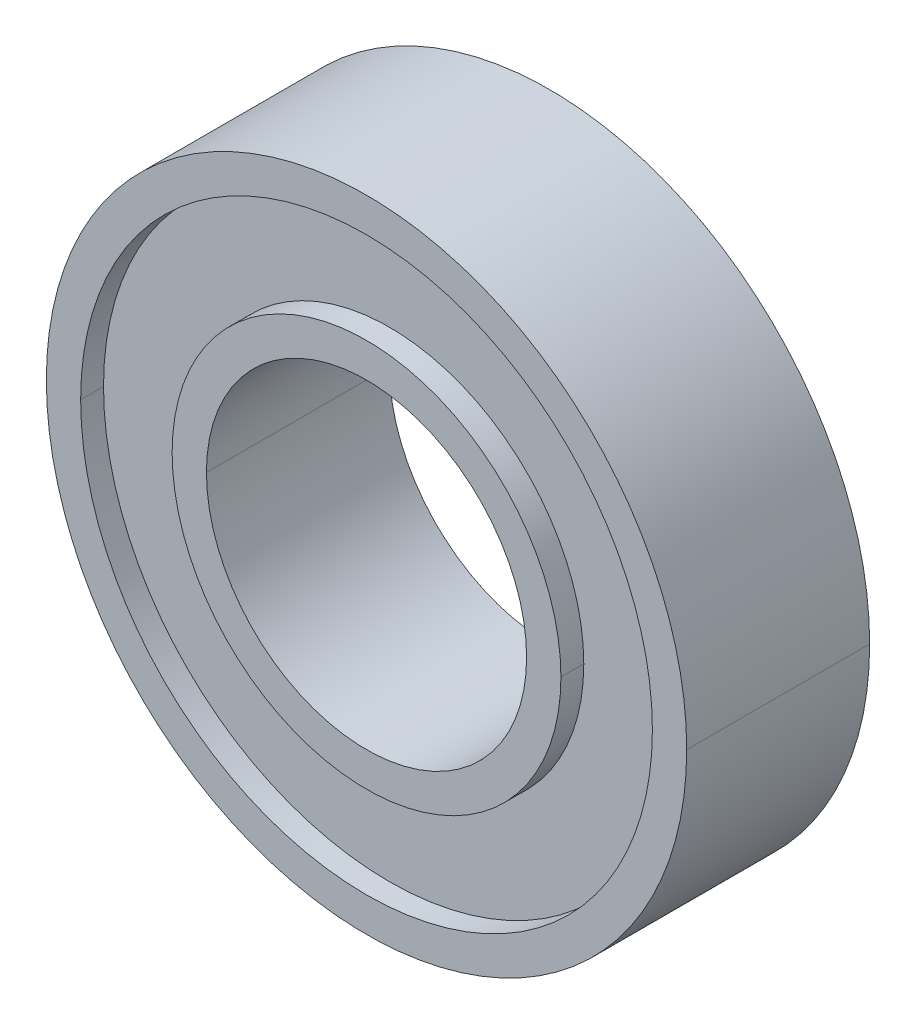
ISO-10303-21;
HEADER;
FILE_DESCRIPTION(('STEP AP214'),'2;1');
FILE_NAME('part.step','',(''),(''),'','','');
FILE_SCHEMA(('AUTOMOTIVE_DESIGN { 1 0 10303 214 1 1 1 1 }'));
ENDSEC;
DATA;
#1=APPLICATION_CONTEXT('core data for automotive mechanical design processes');
#2=APPLICATION_PROTOCOL_DEFINITION('international standard','automotive_design',2000,#1);
#3=PRODUCT_CONTEXT('',#1,'mechanical');
#4=PRODUCT('Part','Part','',(#3));
#5=PRODUCT_RELATED_PRODUCT_CATEGORY('part','',(#4));
#6=PRODUCT_DEFINITION_FORMATION('','',#4);
#7=PRODUCT_DEFINITION_CONTEXT('part definition',#1,'design');
#8=PRODUCT_DEFINITION('design','',#6,#7);
#9=PRODUCT_DEFINITION_SHAPE('','',#8);
#10=(LENGTH_UNIT() NAMED_UNIT(*) SI_UNIT(.MILLI.,.METRE.));
#11=(NAMED_UNIT(*) PLANE_ANGLE_UNIT() SI_UNIT($,.RADIAN.));
#12=(NAMED_UNIT(*) SI_UNIT($,.STERADIAN.) SOLID_ANGLE_UNIT());
#13=UNCERTAINTY_MEASURE_WITH_UNIT(LENGTH_MEASURE(1.E-05),#10,'distance_accuracy_value','');
#14=(GEOMETRIC_REPRESENTATION_CONTEXT(3) GLOBAL_UNCERTAINTY_ASSIGNED_CONTEXT((#13)) GLOBAL_UNIT_ASSIGNED_CONTEXT((#10,
#11,#12)) REPRESENTATION_CONTEXT('',''));
#15=CARTESIAN_POINT('',(0.,0.,0.));
#16=DIRECTION('',(0.,0.,1.));
#17=DIRECTION('',(1.,0.,0.));
#18=AXIS2_PLACEMENT_3D('',#15,#16,#17);
#19=CARTESIAN_POINT('',(0.,0.,0.));
#20=DIRECTION('',(0.,0.,1.));
#21=DIRECTION('',(1.,0.,0.));
#22=AXIS2_PLACEMENT_3D('',#19,#20,#21);
#23=PLANE('',#22);
#24=CARTESIAN_POINT('',(0.,0.,0.));
#25=DIRECTION('',(0.,0.,-1.));
#26=DIRECTION('',(-1.,0.,0.));
#27=AXIS2_PLACEMENT_3D('',#24,#25,#26);
#28=CIRCLE('',#27,3.5);
#29=CARTESIAN_POINT('',(-3.5,0.,0.));
#30=VERTEX_POINT('',#29);
#31=CARTESIAN_POINT('',(3.5,0.,0.));
#32=VERTEX_POINT('',#31);
#33=EDGE_CURVE('E27',#30,#32,#28,.T.);
#34=ORIENTED_EDGE('',*,*,#33,.F.);
#35=CARTESIAN_POINT('',(0.,0.,0.));
#36=DIRECTION('',(0.,0.,-1.));
#37=DIRECTION('',(1.,0.,0.));
#38=AXIS2_PLACEMENT_3D('',#35,#36,#37);
#39=CIRCLE('',#38,3.5);
#40=EDGE_CURVE('E36',#32,#30,#39,.T.);
#41=ORIENTED_EDGE('',*,*,#40,.F.);
#42=EDGE_LOOP('',(#34,#41));
#43=FACE_BOUND('',#42,.T.);
#44=CARTESIAN_POINT('',(0.,0.,0.));
#45=DIRECTION('',(0.,0.,1.));
#46=DIRECTION('',(1.,0.,0.));
#47=AXIS2_PLACEMENT_3D('',#44,#45,#46);
#48=CIRCLE('',#47,4.25);
#49=CARTESIAN_POINT('',(4.25,0.,0.));
#50=VERTEX_POINT('',#49);
#51=CARTESIAN_POINT('',(-4.25,0.,0.));
#52=VERTEX_POINT('',#51);
#53=EDGE_CURVE('E104',#50,#52,#48,.T.);
#54=ORIENTED_EDGE('',*,*,#53,.F.);
#55=CARTESIAN_POINT('',(0.,0.,0.));
#56=DIRECTION('',(0.,0.,1.));
#57=DIRECTION('',(-1.,0.,0.));
#58=AXIS2_PLACEMENT_3D('',#55,#56,#57);
#59=CIRCLE('',#58,4.25);
#60=EDGE_CURVE('E102',#52,#50,#59,.T.);
#61=ORIENTED_EDGE('',*,*,#60,.F.);
#62=EDGE_LOOP('',(#54,#61));
#63=FACE_BOUND('',#62,.T.);
#64=ADVANCED_FACE('F16',(#43,#63),#23,.F.);
#65=CARTESIAN_POINT('',(0.,0.,0.));
#66=DIRECTION('',(0.,0.,-1.));
#67=DIRECTION('',(1.,0.,0.));
#68=AXIS2_PLACEMENT_3D('',#65,#66,#67);
#69=CYLINDRICAL_SURFACE('',#68,3.5);
#70=DIRECTION('',(0.,0.,1.));
#71=VECTOR('',#70,1.);
#72=CARTESIAN_POINT('',(3.5,0.,0.));
#73=LINE('',#72,#71);
#74=CARTESIAN_POINT('',(3.5,0.,4.));
#75=VERTEX_POINT('',#74);
#76=EDGE_CURVE('E11',#32,#75,#73,.T.);
#77=ORIENTED_EDGE('',*,*,#76,.T.);
#78=CARTESIAN_POINT('',(0.,0.,4.));
#79=DIRECTION('',(0.,0.,-1.));
#80=DIRECTION('',(-1.,0.,0.));
#81=AXIS2_PLACEMENT_3D('',#78,#79,#80);
#82=CIRCLE('',#81,3.5);
#83=CARTESIAN_POINT('',(-3.5,0.,4.));
#84=VERTEX_POINT('',#83);
#85=EDGE_CURVE('E150',#84,#75,#82,.T.);
#86=ORIENTED_EDGE('',*,*,#85,.F.);
#87=DIRECTION('',(0.,0.,1.));
#88=VECTOR('',#87,1.);
#89=CARTESIAN_POINT('',(-3.5,0.,0.));
#90=LINE('',#89,#88);
#91=EDGE_CURVE('E164',#30,#84,#90,.T.);
#92=ORIENTED_EDGE('',*,*,#91,.F.);
#93=ORIENTED_EDGE('',*,*,#33,.T.);
#94=EDGE_LOOP('',(#77,#86,#92,#93));
#95=FACE_BOUND('',#94,.T.);
#96=ADVANCED_FACE('F201',(#95),#69,.F.);
#97=CARTESIAN_POINT('',(0.,0.,0.));
#98=DIRECTION('',(0.,0.,-1.));
#99=DIRECTION('',(1.,0.,0.));
#100=AXIS2_PLACEMENT_3D('',#97,#98,#99);
#101=CYLINDRICAL_SURFACE('',#100,3.5);
#102=ORIENTED_EDGE('',*,*,#91,.T.);
#103=CARTESIAN_POINT('',(0.,0.,4.));
#104=DIRECTION('',(0.,0.,-1.));
#105=DIRECTION('',(1.,0.,0.));
#106=AXIS2_PLACEMENT_3D('',#103,#104,#105);
#107=CIRCLE('',#106,3.5);
#108=EDGE_CURVE('E152',#75,#84,#107,.T.);
#109=ORIENTED_EDGE('',*,*,#108,.F.);
#110=ORIENTED_EDGE('',*,*,#76,.F.);
#111=ORIENTED_EDGE('',*,*,#40,.T.);
#112=EDGE_LOOP('',(#102,#109,#110,#111));
#113=FACE_BOUND('',#112,.T.);
#114=ADVANCED_FACE('F204',(#113),#101,.F.);
#115=CARTESIAN_POINT('',(0.,0.,0.));
#116=DIRECTION('',(0.,0.,-1.));
#117=DIRECTION('',(1.,0.,0.));
#118=AXIS2_PLACEMENT_3D('',#115,#116,#117);
#119=CYLINDRICAL_SURFACE('',#118,4.25);
#120=ORIENTED_EDGE('',*,*,#53,.T.);
#121=DIRECTION('',(0.,0.,1.));
#122=VECTOR('',#121,1.);
#123=CARTESIAN_POINT('',(-4.25,0.,0.));
#124=LINE('',#123,#122);
#125=CARTESIAN_POINT('',(-4.25,0.,0.5));
#126=VERTEX_POINT('',#125);
#127=EDGE_CURVE('E116',#52,#126,#124,.T.);
#128=ORIENTED_EDGE('',*,*,#127,.T.);
#129=CARTESIAN_POINT('',(0.,0.,0.5));
#130=DIRECTION('',(0.,0.,-1.));
#131=DIRECTION('',(-1.,0.,0.));
#132=AXIS2_PLACEMENT_3D('',#129,#130,#131);
#133=CIRCLE('',#132,4.25);
#134=CARTESIAN_POINT('',(4.25,0.,0.5));
#135=VERTEX_POINT('',#134);
#136=EDGE_CURVE('E122',#126,#135,#133,.T.);
#137=ORIENTED_EDGE('',*,*,#136,.T.);
#138=DIRECTION('',(0.,0.,1.));
#139=VECTOR('',#138,1.);
#140=CARTESIAN_POINT('',(4.25,0.,0.));
#141=LINE('',#140,#139);
#142=EDGE_CURVE('E110',#50,#135,#141,.T.);
#143=ORIENTED_EDGE('',*,*,#142,.F.);
#144=EDGE_LOOP('',(#120,#128,#137,#143));
#145=FACE_BOUND('',#144,.T.);
#146=ADVANCED_FACE('F114',(#145),#119,.T.);
#147=CARTESIAN_POINT('',(0.,0.,0.));
#148=DIRECTION('',(0.,0.,-1.));
#149=DIRECTION('',(1.,0.,0.));
#150=AXIS2_PLACEMENT_3D('',#147,#148,#149);
#151=CYLINDRICAL_SURFACE('',#150,4.25);
#152=CARTESIAN_POINT('',(0.,0.,0.5));
#153=DIRECTION('',(0.,0.,-1.));
#154=DIRECTION('',(1.,0.,0.));
#155=AXIS2_PLACEMENT_3D('',#152,#153,#154);
#156=CIRCLE('',#155,4.25);
#157=EDGE_CURVE('E109',#135,#126,#156,.T.);
#158=ORIENTED_EDGE('',*,*,#157,.T.);
#159=ORIENTED_EDGE('',*,*,#127,.F.);
#160=ORIENTED_EDGE('',*,*,#60,.T.);
#161=ORIENTED_EDGE('',*,*,#142,.T.);
#162=EDGE_LOOP('',(#158,#159,#160,#161));
#163=FACE_BOUND('',#162,.T.);
#164=ADVANCED_FACE('F18',(#163),#151,.T.);
#165=CARTESIAN_POINT('',(0.,0.,4.));
#166=DIRECTION('',(0.,0.,1.));
#167=DIRECTION('',(1.,0.,0.));
#168=AXIS2_PLACEMENT_3D('',#165,#166,#167);
#169=PLANE('',#168);
#170=ORIENTED_EDGE('',*,*,#85,.T.);
#171=ORIENTED_EDGE('',*,*,#108,.T.);
#172=EDGE_LOOP('',(#170,#171));
#173=FACE_BOUND('',#172,.T.);
#174=CARTESIAN_POINT('',(0.,0.,4.));
#175=DIRECTION('',(0.,0.,1.));
#176=DIRECTION('',(1.,0.,0.));
#177=AXIS2_PLACEMENT_3D('',#174,#175,#176);
#178=CIRCLE('',#177,4.25);
#179=CARTESIAN_POINT('',(4.25,0.,4.));
#180=VERTEX_POINT('',#179);
#181=CARTESIAN_POINT('',(-4.25,0.,4.));
#182=VERTEX_POINT('',#181);
#183=EDGE_CURVE('E168',#180,#182,#178,.T.);
#184=ORIENTED_EDGE('',*,*,#183,.T.);
#185=CARTESIAN_POINT('',(0.,0.,4.));
#186=DIRECTION('',(0.,0.,1.));
#187=DIRECTION('',(-1.,0.,0.));
#188=AXIS2_PLACEMENT_3D('',#185,#186,#187);
#189=CIRCLE('',#188,4.25);
#190=EDGE_CURVE('E191',#182,#180,#189,.T.);
#191=ORIENTED_EDGE('',*,*,#190,.T.);
#192=EDGE_LOOP('',(#184,#191));
#193=FACE_BOUND('',#192,.T.);
#194=ADVANCED_FACE('F206',(#173,#193),#169,.T.);
#195=CARTESIAN_POINT('',(0.,0.,0.5));
#196=DIRECTION('',(0.,0.,1.));
#197=DIRECTION('',(1.,0.,0.));
#198=AXIS2_PLACEMENT_3D('',#195,#196,#197);
#199=PLANE('',#198);
#200=CARTESIAN_POINT('',(0.,0.,0.5));
#201=DIRECTION('',(0.,0.,1.));
#202=DIRECTION('',(-1.,0.,0.));
#203=AXIS2_PLACEMENT_3D('',#200,#201,#202);
#204=CIRCLE('',#203,6.25);
#205=CARTESIAN_POINT('',(-6.25,0.,0.5));
#206=VERTEX_POINT('',#205);
#207=CARTESIAN_POINT('',(6.25,0.,0.5));
#208=VERTEX_POINT('',#207);
#209=EDGE_CURVE('E149',#206,#208,#204,.T.);
#210=ORIENTED_EDGE('',*,*,#209,.F.);
#211=CARTESIAN_POINT('',(0.,0.,0.5));
#212=DIRECTION('',(0.,0.,1.));
#213=DIRECTION('',(1.,0.,0.));
#214=AXIS2_PLACEMENT_3D('',#211,#212,#213);
#215=CIRCLE('',#214,6.25);
#216=EDGE_CURVE('E154',#208,#206,#215,.T.);
#217=ORIENTED_EDGE('',*,*,#216,.F.);
#218=EDGE_LOOP('',(#210,#217));
#219=FACE_BOUND('',#218,.T.);
#220=ORIENTED_EDGE('',*,*,#136,.F.);
#221=ORIENTED_EDGE('',*,*,#157,.F.);
#222=EDGE_LOOP('',(#220,#221));
#223=FACE_BOUND('',#222,.T.);
#224=ADVANCED_FACE('F209',(#219,#223),#199,.F.);
#225=CARTESIAN_POINT('',(0.,0.,4.));
#226=DIRECTION('',(0.,0.,-1.));
#227=DIRECTION('',(1.,0.,0.));
#228=AXIS2_PLACEMENT_3D('',#225,#226,#227);
#229=CYLINDRICAL_SURFACE('',#228,4.25);
#230=DIRECTION('',(0.,0.,-1.));
#231=VECTOR('',#230,1.);
#232=CARTESIAN_POINT('',(4.25,0.,4.));
#233=LINE('',#232,#231);
#234=CARTESIAN_POINT('',(4.25,0.,3.5));
#235=VERTEX_POINT('',#234);
#236=EDGE_CURVE('E194',#180,#235,#233,.T.);
#237=ORIENTED_EDGE('',*,*,#236,.T.);
#238=CARTESIAN_POINT('',(0.,0.,3.5));
#239=DIRECTION('',(0.,0.,-1.));
#240=DIRECTION('',(-1.,0.,0.));
#241=AXIS2_PLACEMENT_3D('',#238,#239,#240);
#242=CIRCLE('',#241,4.25);
#243=CARTESIAN_POINT('',(-4.25,0.,3.5));
#244=VERTEX_POINT('',#243);
#245=EDGE_CURVE('E161',#244,#235,#242,.T.);
#246=ORIENTED_EDGE('',*,*,#245,.F.);
#247=DIRECTION('',(0.,0.,-1.));
#248=VECTOR('',#247,1.);
#249=CARTESIAN_POINT('',(-4.25,0.,4.));
#250=LINE('',#249,#248);
#251=EDGE_CURVE('E20',#182,#244,#250,.T.);
#252=ORIENTED_EDGE('',*,*,#251,.F.);
#253=ORIENTED_EDGE('',*,*,#183,.F.);
#254=EDGE_LOOP('',(#237,#246,#252,#253));
#255=FACE_BOUND('',#254,.T.);
#256=ADVANCED_FACE('F217',(#255),#229,.T.);
#257=CARTESIAN_POINT('',(0.,0.,4.));
#258=DIRECTION('',(0.,0.,-1.));
#259=DIRECTION('',(1.,0.,0.));
#260=AXIS2_PLACEMENT_3D('',#257,#258,#259);
#261=CYLINDRICAL_SURFACE('',#260,4.25);
#262=ORIENTED_EDGE('',*,*,#251,.T.);
#263=CARTESIAN_POINT('',(0.,0.,3.5));
#264=DIRECTION('',(0.,0.,-1.));
#265=DIRECTION('',(1.,0.,0.));
#266=AXIS2_PLACEMENT_3D('',#263,#264,#265);
#267=CIRCLE('',#266,4.25);
#268=EDGE_CURVE('E231',#235,#244,#267,.T.);
#269=ORIENTED_EDGE('',*,*,#268,.F.);
#270=ORIENTED_EDGE('',*,*,#236,.F.);
#271=ORIENTED_EDGE('',*,*,#190,.F.);
#272=EDGE_LOOP('',(#262,#269,#270,#271));
#273=FACE_BOUND('',#272,.T.);
#274=ADVANCED_FACE('F287',(#273),#261,.T.);
#275=CARTESIAN_POINT('',(0.,0.,0.));
#276=DIRECTION('',(0.,0.,-1.));
#277=DIRECTION('',(1.,0.,0.));
#278=AXIS2_PLACEMENT_3D('',#275,#276,#277);
#279=CYLINDRICAL_SURFACE('',#278,6.25);
#280=CARTESIAN_POINT('',(0.,0.,0.));
#281=DIRECTION('',(0.,0.,1.));
#282=DIRECTION('',(-1.,0.,0.));
#283=AXIS2_PLACEMENT_3D('',#280,#281,#282);
#284=CIRCLE('',#283,6.25);
#285=CARTESIAN_POINT('',(-6.25,0.,0.));
#286=VERTEX_POINT('',#285);
#287=CARTESIAN_POINT('',(6.25,0.,0.));
#288=VERTEX_POINT('',#287);
#289=EDGE_CURVE('E187',#286,#288,#284,.T.);
#290=ORIENTED_EDGE('',*,*,#289,.F.);
#291=DIRECTION('',(0.,0.,1.));
#292=VECTOR('',#291,1.);
#293=CARTESIAN_POINT('',(-6.25,0.,0.));
#294=LINE('',#293,#292);
#295=EDGE_CURVE('E145',#286,#206,#294,.T.);
#296=ORIENTED_EDGE('',*,*,#295,.T.);
#297=ORIENTED_EDGE('',*,*,#209,.T.);
#298=DIRECTION('',(0.,0.,1.));
#299=VECTOR('',#298,1.);
#300=CARTESIAN_POINT('',(6.25,0.,0.));
#301=LINE('',#300,#299);
#302=EDGE_CURVE('E132',#288,#208,#301,.T.);
#303=ORIENTED_EDGE('',*,*,#302,.F.);
#304=EDGE_LOOP('',(#290,#296,#297,#303));
#305=FACE_BOUND('',#304,.T.);
#306=ADVANCED_FACE('F258',(#305),#279,.F.);
#307=CARTESIAN_POINT('',(0.,0.,0.));
#308=DIRECTION('',(0.,0.,-1.));
#309=DIRECTION('',(1.,0.,0.));
#310=AXIS2_PLACEMENT_3D('',#307,#308,#309);
#311=CYLINDRICAL_SURFACE('',#310,6.25);
#312=ORIENTED_EDGE('',*,*,#216,.T.);
#313=ORIENTED_EDGE('',*,*,#295,.F.);
#314=CARTESIAN_POINT('',(0.,0.,0.));
#315=DIRECTION('',(0.,0.,1.));
#316=DIRECTION('',(1.,0.,0.));
#317=AXIS2_PLACEMENT_3D('',#314,#315,#316);
#318=CIRCLE('',#317,6.25);
#319=EDGE_CURVE('E183',#288,#286,#318,.T.);
#320=ORIENTED_EDGE('',*,*,#319,.F.);
#321=ORIENTED_EDGE('',*,*,#302,.T.);
#322=EDGE_LOOP('',(#312,#313,#320,#321));
#323=FACE_BOUND('',#322,.T.);
#324=ADVANCED_FACE('F264',(#323),#311,.F.);
#325=CARTESIAN_POINT('',(0.,0.,3.5));
#326=DIRECTION('',(0.,0.,1.));
#327=DIRECTION('',(1.,0.,0.));
#328=AXIS2_PLACEMENT_3D('',#325,#326,#327);
#329=PLANE('',#328);
#330=CARTESIAN_POINT('',(0.,0.,3.5));
#331=DIRECTION('',(0.,0.,1.));
#332=DIRECTION('',(-1.,0.,0.));
#333=AXIS2_PLACEMENT_3D('',#330,#331,#332);
#334=CIRCLE('',#333,6.25);
#335=CARTESIAN_POINT('',(-6.25,0.,3.5));
#336=VERTEX_POINT('',#335);
#337=CARTESIAN_POINT('',(6.25,0.,3.5));
#338=VERTEX_POINT('',#337);
#339=EDGE_CURVE('E160',#336,#338,#334,.T.);
#340=ORIENTED_EDGE('',*,*,#339,.T.);
#341=CARTESIAN_POINT('',(0.,0.,3.5));
#342=DIRECTION('',(0.,0.,1.));
#343=DIRECTION('',(1.,0.,0.));
#344=AXIS2_PLACEMENT_3D('',#341,#342,#343);
#345=CIRCLE('',#344,6.25);
#346=EDGE_CURVE('E157',#338,#336,#345,.T.);
#347=ORIENTED_EDGE('',*,*,#346,.T.);
#348=EDGE_LOOP('',(#340,#347));
#349=FACE_BOUND('',#348,.T.);
#350=ORIENTED_EDGE('',*,*,#245,.T.);
#351=ORIENTED_EDGE('',*,*,#268,.T.);
#352=EDGE_LOOP('',(#350,#351));
#353=FACE_BOUND('',#352,.T.);
#354=ADVANCED_FACE('F273',(#349,#353),#329,.T.);
#355=CARTESIAN_POINT('',(0.,0.,0.));
#356=DIRECTION('',(0.,0.,1.));
#357=DIRECTION('',(1.,0.,0.));
#358=AXIS2_PLACEMENT_3D('',#355,#356,#357);
#359=PLANE('',#358);
#360=ORIENTED_EDGE('',*,*,#289,.T.);
#361=ORIENTED_EDGE('',*,*,#319,.T.);
#362=EDGE_LOOP('',(#360,#361));
#363=FACE_BOUND('',#362,.T.);
#364=CARTESIAN_POINT('',(0.,0.,0.));
#365=DIRECTION('',(0.,0.,1.));
#366=DIRECTION('',(-1.,0.,0.));
#367=AXIS2_PLACEMENT_3D('',#364,#365,#366);
#368=CIRCLE('',#367,7.);
#369=CARTESIAN_POINT('',(-7.,0.,0.));
#370=VERTEX_POINT('',#369);
#371=CARTESIAN_POINT('',(7.,0.,0.));
#372=VERTEX_POINT('',#371);
#373=EDGE_CURVE('E245',#370,#372,#368,.T.);
#374=ORIENTED_EDGE('',*,*,#373,.F.);
#375=CARTESIAN_POINT('',(0.,0.,0.));
#376=DIRECTION('',(0.,0.,1.));
#377=DIRECTION('',(1.,0.,0.));
#378=AXIS2_PLACEMENT_3D('',#375,#376,#377);
#379=CIRCLE('',#378,7.);
#380=EDGE_CURVE('E140',#372,#370,#379,.T.);
#381=ORIENTED_EDGE('',*,*,#380,.F.);
#382=EDGE_LOOP('',(#374,#381));
#383=FACE_BOUND('',#382,.T.);
#384=ADVANCED_FACE('F269',(#363,#383),#359,.F.);
#385=CARTESIAN_POINT('',(0.,0.,4.));
#386=DIRECTION('',(0.,0.,-1.));
#387=DIRECTION('',(1.,0.,0.));
#388=AXIS2_PLACEMENT_3D('',#385,#386,#387);
#389=CYLINDRICAL_SURFACE('',#388,6.25);
#390=DIRECTION('',(0.,0.,-1.));
#391=VECTOR('',#390,1.);
#392=CARTESIAN_POINT('',(6.25,0.,4.));
#393=LINE('',#392,#391);
#394=CARTESIAN_POINT('',(6.25,0.,4.));
#395=VERTEX_POINT('',#394);
#396=EDGE_CURVE('E138',#395,#338,#393,.T.);
#397=ORIENTED_EDGE('',*,*,#396,.T.);
#398=ORIENTED_EDGE('',*,*,#339,.F.);
#399=DIRECTION('',(0.,0.,-1.));
#400=VECTOR('',#399,1.);
#401=CARTESIAN_POINT('',(-6.25,0.,4.));
#402=LINE('',#401,#400);
#403=CARTESIAN_POINT('',(-6.25,0.,4.));
#404=VERTEX_POINT('',#403);
#405=EDGE_CURVE('E139',#404,#336,#402,.T.);
#406=ORIENTED_EDGE('',*,*,#405,.F.);
#407=CARTESIAN_POINT('',(0.,0.,4.));
#408=DIRECTION('',(0.,0.,1.));
#409=DIRECTION('',(-1.,0.,0.));
#410=AXIS2_PLACEMENT_3D('',#407,#408,#409);
#411=CIRCLE('',#410,6.25);
#412=EDGE_CURVE('E135',#404,#395,#411,.T.);
#413=ORIENTED_EDGE('',*,*,#412,.T.);
#414=EDGE_LOOP('',(#397,#398,#406,#413));
#415=FACE_BOUND('',#414,.T.);
#416=ADVANCED_FACE('F272',(#415),#389,.F.);
#417=CARTESIAN_POINT('',(0.,0.,4.));
#418=DIRECTION('',(0.,0.,-1.));
#419=DIRECTION('',(1.,0.,0.));
#420=AXIS2_PLACEMENT_3D('',#417,#418,#419);
#421=CYLINDRICAL_SURFACE('',#420,6.25);
#422=ORIENTED_EDGE('',*,*,#405,.T.);
#423=ORIENTED_EDGE('',*,*,#346,.F.);
#424=ORIENTED_EDGE('',*,*,#396,.F.);
#425=CARTESIAN_POINT('',(0.,0.,4.));
#426=DIRECTION('',(0.,0.,1.));
#427=DIRECTION('',(1.,0.,0.));
#428=AXIS2_PLACEMENT_3D('',#425,#426,#427);
#429=CIRCLE('',#428,6.25);
#430=EDGE_CURVE('E169',#395,#404,#429,.T.);
#431=ORIENTED_EDGE('',*,*,#430,.T.);
#432=EDGE_LOOP('',(#422,#423,#424,#431));
#433=FACE_BOUND('',#432,.T.);
#434=ADVANCED_FACE('F311',(#433),#421,.F.);
#435=CARTESIAN_POINT('',(0.,0.,0.));
#436=DIRECTION('',(0.,0.,-1.));
#437=DIRECTION('',(1.,0.,0.));
#438=AXIS2_PLACEMENT_3D('',#435,#436,#437);
#439=CYLINDRICAL_SURFACE('',#438,7.);
#440=DIRECTION('',(0.,0.,1.));
#441=VECTOR('',#440,1.);
#442=CARTESIAN_POINT('',(7.,0.,0.));
#443=LINE('',#442,#441);
#444=CARTESIAN_POINT('',(7.,0.,4.));
#445=VERTEX_POINT('',#444);
#446=EDGE_CURVE('E172',#372,#445,#443,.T.);
#447=ORIENTED_EDGE('',*,*,#446,.T.);
#448=CARTESIAN_POINT('',(0.,0.,4.));
#449=DIRECTION('',(0.,0.,1.));
#450=DIRECTION('',(-1.,0.,0.));
#451=AXIS2_PLACEMENT_3D('',#448,#449,#450);
#452=CIRCLE('',#451,7.);
#453=CARTESIAN_POINT('',(-7.,0.,4.));
#454=VERTEX_POINT('',#453);
#455=EDGE_CURVE('E144',#454,#445,#452,.T.);
#456=ORIENTED_EDGE('',*,*,#455,.F.);
#457=DIRECTION('',(0.,0.,1.));
#458=VECTOR('',#457,1.);
#459=CARTESIAN_POINT('',(-7.,0.,0.));
#460=LINE('',#459,#458);
#461=EDGE_CURVE('E143',#370,#454,#460,.T.);
#462=ORIENTED_EDGE('',*,*,#461,.F.);
#463=ORIENTED_EDGE('',*,*,#373,.T.);
#464=EDGE_LOOP('',(#447,#456,#462,#463));
#465=FACE_BOUND('',#464,.T.);
#466=ADVANCED_FACE('F280',(#465),#439,.T.);
#467=CARTESIAN_POINT('',(0.,0.,0.));
#468=DIRECTION('',(0.,0.,-1.));
#469=DIRECTION('',(1.,0.,0.));
#470=AXIS2_PLACEMENT_3D('',#467,#468,#469);
#471=CYLINDRICAL_SURFACE('',#470,7.);
#472=ORIENTED_EDGE('',*,*,#461,.T.);
#473=CARTESIAN_POINT('',(0.,0.,4.));
#474=DIRECTION('',(0.,0.,1.));
#475=DIRECTION('',(1.,0.,0.));
#476=AXIS2_PLACEMENT_3D('',#473,#474,#475);
#477=CIRCLE('',#476,7.);
#478=EDGE_CURVE('E174',#445,#454,#477,.T.);
#479=ORIENTED_EDGE('',*,*,#478,.F.);
#480=ORIENTED_EDGE('',*,*,#446,.F.);
#481=ORIENTED_EDGE('',*,*,#380,.T.);
#482=EDGE_LOOP('',(#472,#479,#480,#481));
#483=FACE_BOUND('',#482,.T.);
#484=ADVANCED_FACE('F304',(#483),#471,.T.);
#485=CARTESIAN_POINT('',(0.,0.,4.));
#486=DIRECTION('',(0.,0.,1.));
#487=DIRECTION('',(1.,0.,0.));
#488=AXIS2_PLACEMENT_3D('',#485,#486,#487);
#489=PLANE('',#488);
#490=ORIENTED_EDGE('',*,*,#412,.F.);
#491=ORIENTED_EDGE('',*,*,#430,.F.);
#492=EDGE_LOOP('',(#490,#491));
#493=FACE_BOUND('',#492,.T.);
#494=ORIENTED_EDGE('',*,*,#455,.T.);
#495=ORIENTED_EDGE('',*,*,#478,.T.);
#496=EDGE_LOOP('',(#494,#495));
#497=FACE_BOUND('',#496,.T.);
#498=ADVANCED_FACE('F307',(#493,#497),#489,.T.);
#499=CLOSED_SHELL('',(#64,#96,#114,#146,#164,#194,#224,#256,#274,#306,#324,#354,#384,#416,#434,
#466,#484,#498));
#500=MANIFOLD_SOLID_BREP('B1',#499);
#501=ADVANCED_BREP_SHAPE_REPRESENTATION('',(#18,#500),#14);
#502=SHAPE_DEFINITION_REPRESENTATION(#9,#501);
ENDSEC;
END-ISO-10303-21;
